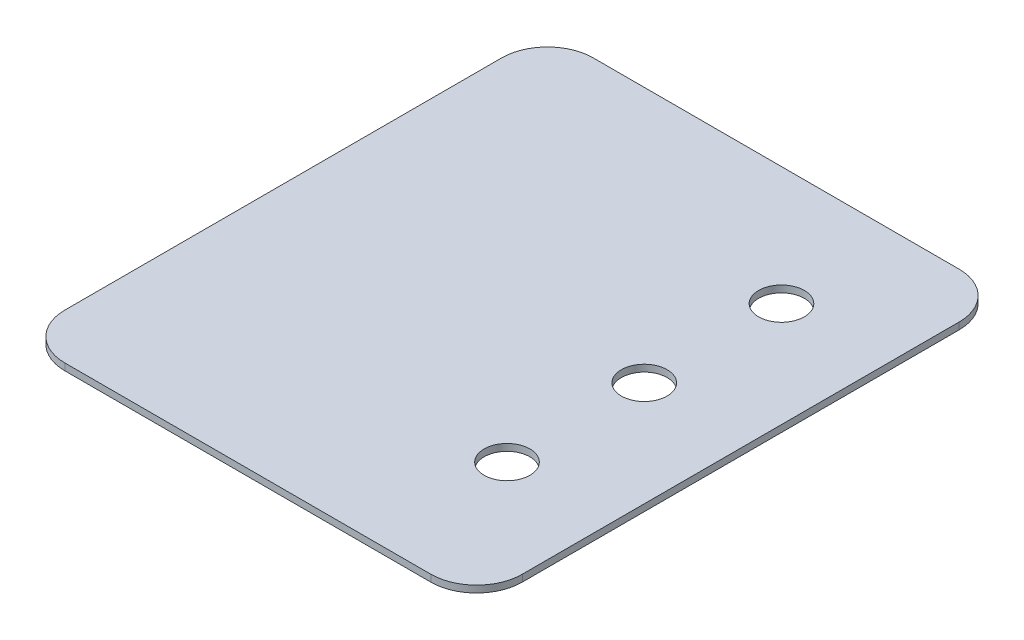
ISO-10303-21;
HEADER;
FILE_DESCRIPTION(('STEP AP214'),'2;1');
FILE_NAME('part.step','',(''),(''),'','','');
FILE_SCHEMA(('AUTOMOTIVE_DESIGN { 1 0 10303 214 1 1 1 1 }'));
ENDSEC;
DATA;
#1=APPLICATION_CONTEXT('core data for automotive mechanical design processes');
#2=APPLICATION_PROTOCOL_DEFINITION('international standard','automotive_design',2000,#1);
#3=PRODUCT_CONTEXT('',#1,'mechanical');
#4=PRODUCT('Part','Part','',(#3));
#5=PRODUCT_RELATED_PRODUCT_CATEGORY('part','',(#4));
#6=PRODUCT_DEFINITION_FORMATION('','',#4);
#7=PRODUCT_DEFINITION_CONTEXT('part definition',#1,'design');
#8=PRODUCT_DEFINITION('design','',#6,#7);
#9=PRODUCT_DEFINITION_SHAPE('','',#8);
#10=(LENGTH_UNIT() NAMED_UNIT(*) SI_UNIT(.MILLI.,.METRE.));
#11=(NAMED_UNIT(*) PLANE_ANGLE_UNIT() SI_UNIT($,.RADIAN.));
#12=(NAMED_UNIT(*) SI_UNIT($,.STERADIAN.) SOLID_ANGLE_UNIT());
#13=UNCERTAINTY_MEASURE_WITH_UNIT(LENGTH_MEASURE(1.E-05),#10,'distance_accuracy_value','');
#14=(GEOMETRIC_REPRESENTATION_CONTEXT(3) GLOBAL_UNCERTAINTY_ASSIGNED_CONTEXT((#13)) GLOBAL_UNIT_ASSIGNED_CONTEXT((#10,
#11,#12)) REPRESENTATION_CONTEXT('',''));
#15=CARTESIAN_POINT('',(0.,0.,0.));
#16=DIRECTION('',(0.,0.,1.));
#17=DIRECTION('',(1.,0.,0.));
#18=AXIS2_PLACEMENT_3D('',#15,#16,#17);
#19=CARTESIAN_POINT('',(-16.,0.6,19.1));
#20=DIRECTION('',(0.,-1.,0.));
#21=DIRECTION('',(0.,0.,-1.));
#22=AXIS2_PLACEMENT_3D('',#19,#20,#21);
#23=CYLINDRICAL_SURFACE('',#22,4.);
#24=CARTESIAN_POINT('',(-16.,0.,19.1));
#25=DIRECTION('',(0.,1.,0.));
#26=DIRECTION('',(0.,0.,1.));
#27=AXIS2_PLACEMENT_3D('',#24,#25,#26);
#28=CIRCLE('',#27,4.);
#29=CARTESIAN_POINT('',(-20.,0.,19.1));
#30=VERTEX_POINT('',#29);
#31=CARTESIAN_POINT('',(-16.,0.,23.1));
#32=VERTEX_POINT('',#31);
#33=EDGE_CURVE('E139',#30,#32,#28,.T.);
#34=ORIENTED_EDGE('',*,*,#33,.T.);
#35=DIRECTION('',(0.,-1.,0.));
#36=VECTOR('',#35,1.);
#37=CARTESIAN_POINT('',(-16.,0.6,23.1));
#38=LINE('',#37,#36);
#39=CARTESIAN_POINT('',(-16.,0.6,23.1));
#40=VERTEX_POINT('',#39);
#41=EDGE_CURVE('E11',#40,#32,#38,.T.);
#42=ORIENTED_EDGE('',*,*,#41,.F.);
#43=CARTESIAN_POINT('',(-16.,0.6,19.1));
#44=DIRECTION('',(0.,1.,0.));
#45=DIRECTION('',(0.,0.,1.));
#46=AXIS2_PLACEMENT_3D('',#43,#44,#45);
#47=CIRCLE('',#46,4.);
#48=CARTESIAN_POINT('',(-20.,0.6,19.1));
#49=VERTEX_POINT('',#48);
#50=EDGE_CURVE('E154',#49,#40,#47,.T.);
#51=ORIENTED_EDGE('',*,*,#50,.F.);
#52=DIRECTION('',(0.,-1.,0.));
#53=VECTOR('',#52,1.);
#54=CARTESIAN_POINT('',(-20.,0.6,19.1));
#55=LINE('',#54,#53);
#56=EDGE_CURVE('E135',#49,#30,#55,.T.);
#57=ORIENTED_EDGE('',*,*,#56,.T.);
#58=EDGE_LOOP('',(#34,#42,#51,#57));
#59=FACE_BOUND('',#58,.T.);
#60=ADVANCED_FACE('F41',(#59),#23,.T.);
#61=CARTESIAN_POINT('',(-16.,0.6,23.1));
#62=DIRECTION('',(0.,0.,-1.));
#63=DIRECTION('',(-1.,0.,0.));
#64=AXIS2_PLACEMENT_3D('',#61,#62,#63);
#65=PLANE('',#64);
#66=DIRECTION('',(1.,0.,0.));
#67=VECTOR('',#66,1.);
#68=CARTESIAN_POINT('',(-16.,0.,23.1));
#69=LINE('',#68,#67);
#70=CARTESIAN_POINT('',(16.,0.,23.1));
#71=VERTEX_POINT('',#70);
#72=EDGE_CURVE('E142',#32,#71,#69,.T.);
#73=ORIENTED_EDGE('',*,*,#72,.T.);
#74=DIRECTION('',(0.,-1.,0.));
#75=VECTOR('',#74,1.);
#76=CARTESIAN_POINT('',(16.,0.6,23.1));
#77=LINE('',#76,#75);
#78=CARTESIAN_POINT('',(16.,0.6,23.1));
#79=VERTEX_POINT('',#78);
#80=EDGE_CURVE('E50',#79,#71,#77,.T.);
#81=ORIENTED_EDGE('',*,*,#80,.F.);
#82=DIRECTION('',(1.,0.,0.));
#83=VECTOR('',#82,1.);
#84=CARTESIAN_POINT('',(-16.,0.6,23.1));
#85=LINE('',#84,#83);
#86=EDGE_CURVE('E102',#40,#79,#85,.T.);
#87=ORIENTED_EDGE('',*,*,#86,.F.);
#88=ORIENTED_EDGE('',*,*,#41,.T.);
#89=EDGE_LOOP('',(#73,#81,#87,#88));
#90=FACE_BOUND('',#89,.T.);
#91=ADVANCED_FACE('F248',(#90),#65,.F.);
#92=CARTESIAN_POINT('',(16.,0.6,19.1));
#93=DIRECTION('',(0.,-1.,0.));
#94=DIRECTION('',(0.,0.,-1.));
#95=AXIS2_PLACEMENT_3D('',#92,#93,#94);
#96=CYLINDRICAL_SURFACE('',#95,4.);
#97=CARTESIAN_POINT('',(16.,0.,19.1));
#98=DIRECTION('',(0.,1.,0.));
#99=DIRECTION('',(0.,0.,1.));
#100=AXIS2_PLACEMENT_3D('',#97,#98,#99);
#101=CIRCLE('',#100,4.);
#102=CARTESIAN_POINT('',(20.,0.,19.1));
#103=VERTEX_POINT('',#102);
#104=EDGE_CURVE('E145',#71,#103,#101,.T.);
#105=ORIENTED_EDGE('',*,*,#104,.T.);
#106=DIRECTION('',(0.,-1.,0.));
#107=VECTOR('',#106,1.);
#108=CARTESIAN_POINT('',(20.,0.6,19.1));
#109=LINE('',#108,#107);
#110=CARTESIAN_POINT('',(20.,0.6,19.1));
#111=VERTEX_POINT('',#110);
#112=EDGE_CURVE('E161',#111,#103,#109,.T.);
#113=ORIENTED_EDGE('',*,*,#112,.F.);
#114=CARTESIAN_POINT('',(16.,0.6,19.1));
#115=DIRECTION('',(0.,1.,0.));
#116=DIRECTION('',(0.,0.,1.));
#117=AXIS2_PLACEMENT_3D('',#114,#115,#116);
#118=CIRCLE('',#117,4.);
#119=EDGE_CURVE('E215',#79,#111,#118,.T.);
#120=ORIENTED_EDGE('',*,*,#119,.F.);
#121=ORIENTED_EDGE('',*,*,#80,.T.);
#122=EDGE_LOOP('',(#105,#113,#120,#121));
#123=FACE_BOUND('',#122,.T.);
#124=ADVANCED_FACE('F252',(#123),#96,.T.);
#125=CARTESIAN_POINT('',(20.,0.6,-19.1));
#126=DIRECTION('',(-1.,0.,0.));
#127=DIRECTION('',(0.,0.,1.));
#128=AXIS2_PLACEMENT_3D('',#125,#126,#127);
#129=PLANE('',#128);
#130=DIRECTION('',(0.,0.,-1.));
#131=VECTOR('',#130,1.);
#132=CARTESIAN_POINT('',(20.,0.,-19.1));
#133=LINE('',#132,#131);
#134=CARTESIAN_POINT('',(20.,0.,-19.1));
#135=VERTEX_POINT('',#134);
#136=EDGE_CURVE('E147',#103,#135,#133,.T.);
#137=ORIENTED_EDGE('',*,*,#136,.T.);
#138=DIRECTION('',(0.,-1.,0.));
#139=VECTOR('',#138,1.);
#140=CARTESIAN_POINT('',(20.,0.6,-19.1));
#141=LINE('',#140,#139);
#142=CARTESIAN_POINT('',(20.,0.6,-19.1));
#143=VERTEX_POINT('',#142);
#144=EDGE_CURVE('E158',#143,#135,#141,.T.);
#145=ORIENTED_EDGE('',*,*,#144,.F.);
#146=DIRECTION('',(0.,0.,-1.));
#147=VECTOR('',#146,1.);
#148=CARTESIAN_POINT('',(20.,0.6,-19.1));
#149=LINE('',#148,#147);
#150=EDGE_CURVE('E217',#111,#143,#149,.T.);
#151=ORIENTED_EDGE('',*,*,#150,.F.);
#152=ORIENTED_EDGE('',*,*,#112,.T.);
#153=EDGE_LOOP('',(#137,#145,#151,#152));
#154=FACE_BOUND('',#153,.T.);
#155=ADVANCED_FACE('F223',(#154),#129,.F.);
#156=CARTESIAN_POINT('',(16.,0.6,-19.1));
#157=DIRECTION('',(0.,-1.,0.));
#158=DIRECTION('',(0.,0.,-1.));
#159=AXIS2_PLACEMENT_3D('',#156,#157,#158);
#160=CYLINDRICAL_SURFACE('',#159,4.);
#161=CARTESIAN_POINT('',(16.,0.,-19.1));
#162=DIRECTION('',(0.,1.,0.));
#163=DIRECTION('',(0.,0.,-1.));
#164=AXIS2_PLACEMENT_3D('',#161,#162,#163);
#165=CIRCLE('',#164,4.);
#166=CARTESIAN_POINT('',(16.,0.,-23.1));
#167=VERTEX_POINT('',#166);
#168=EDGE_CURVE('E149',#135,#167,#165,.T.);
#169=ORIENTED_EDGE('',*,*,#168,.T.);
#170=DIRECTION('',(0.,-1.,0.));
#171=VECTOR('',#170,1.);
#172=CARTESIAN_POINT('',(16.,0.6,-23.1));
#173=LINE('',#172,#171);
#174=CARTESIAN_POINT('',(16.,0.6,-23.1));
#175=VERTEX_POINT('',#174);
#176=EDGE_CURVE('E130',#175,#167,#173,.T.);
#177=ORIENTED_EDGE('',*,*,#176,.F.);
#178=CARTESIAN_POINT('',(16.,0.6,-19.1));
#179=DIRECTION('',(0.,1.,0.));
#180=DIRECTION('',(0.,0.,-1.));
#181=AXIS2_PLACEMENT_3D('',#178,#179,#180);
#182=CIRCLE('',#181,4.);
#183=EDGE_CURVE('E121',#143,#175,#182,.T.);
#184=ORIENTED_EDGE('',*,*,#183,.F.);
#185=ORIENTED_EDGE('',*,*,#144,.T.);
#186=EDGE_LOOP('',(#169,#177,#184,#185));
#187=FACE_BOUND('',#186,.T.);
#188=ADVANCED_FACE('F227',(#187),#160,.T.);
#189=CARTESIAN_POINT('',(-16.,0.6,-23.1));
#190=DIRECTION('',(0.,0.,1.));
#191=DIRECTION('',(1.,0.,0.));
#192=AXIS2_PLACEMENT_3D('',#189,#190,#191);
#193=PLANE('',#192);
#194=DIRECTION('',(-1.,0.,0.));
#195=VECTOR('',#194,1.);
#196=CARTESIAN_POINT('',(-16.,0.,-23.1));
#197=LINE('',#196,#195);
#198=CARTESIAN_POINT('',(-16.,0.,-23.1));
#199=VERTEX_POINT('',#198);
#200=EDGE_CURVE('E129',#167,#199,#197,.T.);
#201=ORIENTED_EDGE('',*,*,#200,.T.);
#202=DIRECTION('',(0.,-1.,0.));
#203=VECTOR('',#202,1.);
#204=CARTESIAN_POINT('',(-16.,0.6,-23.1));
#205=LINE('',#204,#203);
#206=CARTESIAN_POINT('',(-16.,0.6,-23.1));
#207=VERTEX_POINT('',#206);
#208=EDGE_CURVE('E126',#207,#199,#205,.T.);
#209=ORIENTED_EDGE('',*,*,#208,.F.);
#210=DIRECTION('',(-1.,0.,0.));
#211=VECTOR('',#210,1.);
#212=CARTESIAN_POINT('',(-16.,0.6,-23.1));
#213=LINE('',#212,#211);
#214=EDGE_CURVE('E115',#175,#207,#213,.T.);
#215=ORIENTED_EDGE('',*,*,#214,.F.);
#216=ORIENTED_EDGE('',*,*,#176,.T.);
#217=EDGE_LOOP('',(#201,#209,#215,#216));
#218=FACE_BOUND('',#217,.T.);
#219=ADVANCED_FACE('F127',(#218),#193,.F.);
#220=CARTESIAN_POINT('',(-16.,0.6,-19.1));
#221=DIRECTION('',(0.,-1.,0.));
#222=DIRECTION('',(0.,0.,-1.));
#223=AXIS2_PLACEMENT_3D('',#220,#221,#222);
#224=CYLINDRICAL_SURFACE('',#223,4.);
#225=CARTESIAN_POINT('',(-16.,0.,-19.1));
#226=DIRECTION('',(0.,1.,0.));
#227=DIRECTION('',(0.,0.,1.));
#228=AXIS2_PLACEMENT_3D('',#225,#226,#227);
#229=CIRCLE('',#228,4.);
#230=CARTESIAN_POINT('',(-20.,0.,-19.1));
#231=VERTEX_POINT('',#230);
#232=EDGE_CURVE('E88',#199,#231,#229,.T.);
#233=ORIENTED_EDGE('',*,*,#232,.T.);
#234=DIRECTION('',(0.,-1.,0.));
#235=VECTOR('',#234,1.);
#236=CARTESIAN_POINT('',(-20.,0.6,-19.1));
#237=LINE('',#236,#235);
#238=CARTESIAN_POINT('',(-20.,0.6,-19.1));
#239=VERTEX_POINT('',#238);
#240=EDGE_CURVE('E131',#239,#231,#237,.T.);
#241=ORIENTED_EDGE('',*,*,#240,.F.);
#242=CARTESIAN_POINT('',(-16.,0.6,-19.1));
#243=DIRECTION('',(0.,1.,0.));
#244=DIRECTION('',(0.,0.,1.));
#245=AXIS2_PLACEMENT_3D('',#242,#243,#244);
#246=CIRCLE('',#245,4.);
#247=EDGE_CURVE('E119',#207,#239,#246,.T.);
#248=ORIENTED_EDGE('',*,*,#247,.F.);
#249=ORIENTED_EDGE('',*,*,#208,.T.);
#250=EDGE_LOOP('',(#233,#241,#248,#249));
#251=FACE_BOUND('',#250,.T.);
#252=ADVANCED_FACE('F133',(#251),#224,.T.);
#253=CARTESIAN_POINT('',(-20.,0.6,-19.1));
#254=DIRECTION('',(1.,0.,0.));
#255=DIRECTION('',(0.,0.,-1.));
#256=AXIS2_PLACEMENT_3D('',#253,#254,#255);
#257=PLANE('',#256);
#258=DIRECTION('',(0.,0.,1.));
#259=VECTOR('',#258,1.);
#260=CARTESIAN_POINT('',(-20.,0.,-19.1));
#261=LINE('',#260,#259);
#262=EDGE_CURVE('E94',#231,#30,#261,.T.);
#263=ORIENTED_EDGE('',*,*,#262,.T.);
#264=ORIENTED_EDGE('',*,*,#56,.F.);
#265=DIRECTION('',(0.,0.,1.));
#266=VECTOR('',#265,1.);
#267=CARTESIAN_POINT('',(-20.,0.6,-19.1));
#268=LINE('',#267,#266);
#269=EDGE_CURVE('E59',#239,#49,#268,.T.);
#270=ORIENTED_EDGE('',*,*,#269,.F.);
#271=ORIENTED_EDGE('',*,*,#240,.T.);
#272=EDGE_LOOP('',(#263,#264,#270,#271));
#273=FACE_BOUND('',#272,.T.);
#274=ADVANCED_FACE('F235',(#273),#257,.F.);
#275=CARTESIAN_POINT('',(-16.,0.6,19.1));
#276=DIRECTION('',(0.,1.,0.));
#277=DIRECTION('',(0.,0.,1.));
#278=AXIS2_PLACEMENT_3D('',#275,#276,#277);
#279=PLANE('',#278);
#280=CARTESIAN_POINT('',(10.8424460198941,0.6,11.2783959341694));
#281=DIRECTION('',(0.,1.,0.));
#282=DIRECTION('',(0.,0.,1.));
#283=AXIS2_PLACEMENT_3D('',#280,#281,#282);
#284=CIRCLE('',#283,2.);
#285=CARTESIAN_POINT('',(10.8424460198941,0.6,13.2783959341694));
#286=VERTEX_POINT('',#285);
#287=EDGE_CURVE('E170',#286,#286,#284,.T.);
#288=ORIENTED_EDGE('',*,*,#287,.F.);
#289=EDGE_LOOP('',(#288));
#290=FACE_BOUND('',#289,.T.);
#291=CARTESIAN_POINT('',(10.842446019894,0.6,-0.721604065830581));
#292=DIRECTION('',(0.,1.,0.));
#293=DIRECTION('',(0.,0.,1.));
#294=AXIS2_PLACEMENT_3D('',#291,#292,#293);
#295=CIRCLE('',#294,2.);
#296=CARTESIAN_POINT('',(10.842446019894,0.6,1.27839593416942));
#297=VERTEX_POINT('',#296);
#298=EDGE_CURVE('E205',#297,#297,#295,.T.);
#299=ORIENTED_EDGE('',*,*,#298,.F.);
#300=EDGE_LOOP('',(#299));
#301=FACE_BOUND('',#300,.T.);
#302=CARTESIAN_POINT('',(10.842446019894,0.6,-12.7216040658306));
#303=DIRECTION('',(0.,1.,0.));
#304=DIRECTION('',(0.,0.,1.));
#305=AXIS2_PLACEMENT_3D('',#302,#303,#304);
#306=CIRCLE('',#305,2.);
#307=CARTESIAN_POINT('',(10.842446019894,0.6,-10.7216040658306));
#308=VERTEX_POINT('',#307);
#309=EDGE_CURVE('E201',#308,#308,#306,.T.);
#310=ORIENTED_EDGE('',*,*,#309,.F.);
#311=EDGE_LOOP('',(#310));
#312=FACE_BOUND('',#311,.T.);
#313=ORIENTED_EDGE('',*,*,#50,.T.);
#314=ORIENTED_EDGE('',*,*,#86,.T.);
#315=ORIENTED_EDGE('',*,*,#119,.T.);
#316=ORIENTED_EDGE('',*,*,#150,.T.);
#317=ORIENTED_EDGE('',*,*,#183,.T.);
#318=ORIENTED_EDGE('',*,*,#214,.T.);
#319=ORIENTED_EDGE('',*,*,#247,.T.);
#320=ORIENTED_EDGE('',*,*,#269,.T.);
#321=EDGE_LOOP('',(#313,#314,#315,#316,#317,#318,#319,#320));
#322=FACE_BOUND('',#321,.T.);
#323=ADVANCED_FACE('F117',(#290,#301,#312,#322),#279,.T.);
#324=CARTESIAN_POINT('',(-16.,0.,19.1));
#325=DIRECTION('',(0.,1.,0.));
#326=DIRECTION('',(0.,0.,1.));
#327=AXIS2_PLACEMENT_3D('',#324,#325,#326);
#328=PLANE('',#327);
#329=CARTESIAN_POINT('',(0.,0.,-17.));
#330=DIRECTION('',(0.,1.,0.));
#331=DIRECTION('',(0.,0.,1.));
#332=AXIS2_PLACEMENT_3D('',#329,#330,#331);
#333=CIRCLE('',#332,1.15);
#334=CARTESIAN_POINT('',(0.,0.,-15.85));
#335=VERTEX_POINT('',#334);
#336=EDGE_CURVE('E44',#335,#335,#333,.T.);
#337=ORIENTED_EDGE('',*,*,#336,.T.);
#338=EDGE_LOOP('',(#337));
#339=FACE_BOUND('',#338,.T.);
#340=CARTESIAN_POINT('',(-15.8,0.,-16.9999999999999));
#341=DIRECTION('',(0.,1.,0.));
#342=DIRECTION('',(0.,0.,1.));
#343=AXIS2_PLACEMENT_3D('',#340,#341,#342);
#344=CIRCLE('',#343,1.15);
#345=CARTESIAN_POINT('',(-15.8,0.,-15.8499999999999));
#346=VERTEX_POINT('',#345);
#347=EDGE_CURVE('E196',#346,#346,#344,.T.);
#348=ORIENTED_EDGE('',*,*,#347,.T.);
#349=EDGE_LOOP('',(#348));
#350=FACE_BOUND('',#349,.T.);
#351=CARTESIAN_POINT('',(0.,0.,0.));
#352=DIRECTION('',(0.,1.,0.));
#353=DIRECTION('',(0.,0.,1.));
#354=AXIS2_PLACEMENT_3D('',#351,#352,#353);
#355=CIRCLE('',#354,1.15);
#356=CARTESIAN_POINT('',(0.,0.,1.15));
#357=VERTEX_POINT('',#356);
#358=EDGE_CURVE('E194',#357,#357,#355,.T.);
#359=ORIENTED_EDGE('',*,*,#358,.T.);
#360=EDGE_LOOP('',(#359));
#361=FACE_BOUND('',#360,.T.);
#362=CARTESIAN_POINT('',(-15.8,0.,1.11022302462516E-13));
#363=DIRECTION('',(0.,1.,0.));
#364=DIRECTION('',(0.,0.,1.));
#365=AXIS2_PLACEMENT_3D('',#362,#363,#364);
#366=CIRCLE('',#365,1.15);
#367=CARTESIAN_POINT('',(-15.8,0.,1.15000000000011));
#368=VERTEX_POINT('',#367);
#369=EDGE_CURVE('E191',#368,#368,#366,.T.);
#370=ORIENTED_EDGE('',*,*,#369,.T.);
#371=EDGE_LOOP('',(#370));
#372=FACE_BOUND('',#371,.T.);
#373=CARTESIAN_POINT('',(0.,0.,17.));
#374=DIRECTION('',(0.,1.,0.));
#375=DIRECTION('',(0.,0.,1.));
#376=AXIS2_PLACEMENT_3D('',#373,#374,#375);
#377=CIRCLE('',#376,1.15);
#378=CARTESIAN_POINT('',(0.,0.,18.15));
#379=VERTEX_POINT('',#378);
#380=EDGE_CURVE('E188',#379,#379,#377,.T.);
#381=ORIENTED_EDGE('',*,*,#380,.T.);
#382=EDGE_LOOP('',(#381));
#383=FACE_BOUND('',#382,.T.);
#384=CARTESIAN_POINT('',(-15.8,0.,17.0000000000001));
#385=DIRECTION('',(0.,1.,0.));
#386=DIRECTION('',(0.,0.,1.));
#387=AXIS2_PLACEMENT_3D('',#384,#385,#386);
#388=CIRCLE('',#387,1.15);
#389=CARTESIAN_POINT('',(-15.8,0.,18.1500000000001));
#390=VERTEX_POINT('',#389);
#391=EDGE_CURVE('E185',#390,#390,#388,.T.);
#392=ORIENTED_EDGE('',*,*,#391,.T.);
#393=EDGE_LOOP('',(#392));
#394=FACE_BOUND('',#393,.T.);
#395=CARTESIAN_POINT('',(15.8,0.,-1.11022302462516E-13));
#396=DIRECTION('',(0.,1.,0.));
#397=DIRECTION('',(0.,0.,1.));
#398=AXIS2_PLACEMENT_3D('',#395,#396,#397);
#399=CIRCLE('',#398,1.15);
#400=CARTESIAN_POINT('',(15.8,0.,1.14999999999989));
#401=VERTEX_POINT('',#400);
#402=EDGE_CURVE('E182',#401,#401,#399,.T.);
#403=ORIENTED_EDGE('',*,*,#402,.T.);
#404=EDGE_LOOP('',(#403));
#405=FACE_BOUND('',#404,.T.);
#406=CARTESIAN_POINT('',(15.8,0.,16.9999999999999));
#407=DIRECTION('',(0.,1.,0.));
#408=DIRECTION('',(0.,0.,1.));
#409=AXIS2_PLACEMENT_3D('',#406,#407,#408);
#410=CIRCLE('',#409,1.15);
#411=CARTESIAN_POINT('',(15.8,0.,18.1499999999999));
#412=VERTEX_POINT('',#411);
#413=EDGE_CURVE('E178',#412,#412,#410,.T.);
#414=ORIENTED_EDGE('',*,*,#413,.T.);
#415=EDGE_LOOP('',(#414));
#416=FACE_BOUND('',#415,.T.);
#417=CARTESIAN_POINT('',(15.8,0.,-17.0000000000001));
#418=DIRECTION('',(0.,1.,0.));
#419=DIRECTION('',(0.,0.,1.));
#420=AXIS2_PLACEMENT_3D('',#417,#418,#419);
#421=CIRCLE('',#420,1.15);
#422=CARTESIAN_POINT('',(15.8,0.,-15.8500000000001));
#423=VERTEX_POINT('',#422);
#424=EDGE_CURVE('E175',#423,#423,#421,.T.);
#425=ORIENTED_EDGE('',*,*,#424,.T.);
#426=EDGE_LOOP('',(#425));
#427=FACE_BOUND('',#426,.T.);
#428=CARTESIAN_POINT('',(10.8424460198941,0.,11.2783959341694));
#429=DIRECTION('',(0.,1.,0.));
#430=DIRECTION('',(0.,0.,1.));
#431=AXIS2_PLACEMENT_3D('',#428,#429,#430);
#432=CIRCLE('',#431,2.);
#433=CARTESIAN_POINT('',(10.8424460198941,0.,13.2783959341694));
#434=VERTEX_POINT('',#433);
#435=EDGE_CURVE('E143',#434,#434,#432,.T.);
#436=ORIENTED_EDGE('',*,*,#435,.T.);
#437=EDGE_LOOP('',(#436));
#438=FACE_BOUND('',#437,.T.);
#439=CARTESIAN_POINT('',(10.842446019894,0.,-0.721604065830581));
#440=DIRECTION('',(0.,1.,0.));
#441=DIRECTION('',(0.,0.,1.));
#442=AXIS2_PLACEMENT_3D('',#439,#440,#441);
#443=CIRCLE('',#442,2.);
#444=CARTESIAN_POINT('',(10.842446019894,0.,1.27839593416942));
#445=VERTEX_POINT('',#444);
#446=EDGE_CURVE('E169',#445,#445,#443,.T.);
#447=ORIENTED_EDGE('',*,*,#446,.T.);
#448=EDGE_LOOP('',(#447));
#449=FACE_BOUND('',#448,.T.);
#450=CARTESIAN_POINT('',(10.842446019894,0.,-12.7216040658306));
#451=DIRECTION('',(0.,1.,0.));
#452=DIRECTION('',(0.,0.,1.));
#453=AXIS2_PLACEMENT_3D('',#450,#451,#452);
#454=CIRCLE('',#453,2.);
#455=CARTESIAN_POINT('',(10.842446019894,0.,-10.7216040658306));
#456=VERTEX_POINT('',#455);
#457=EDGE_CURVE('E166',#456,#456,#454,.T.);
#458=ORIENTED_EDGE('',*,*,#457,.T.);
#459=EDGE_LOOP('',(#458));
#460=FACE_BOUND('',#459,.T.);
#461=ORIENTED_EDGE('',*,*,#33,.F.);
#462=ORIENTED_EDGE('',*,*,#262,.F.);
#463=ORIENTED_EDGE('',*,*,#232,.F.);
#464=ORIENTED_EDGE('',*,*,#200,.F.);
#465=ORIENTED_EDGE('',*,*,#168,.F.);
#466=ORIENTED_EDGE('',*,*,#136,.F.);
#467=ORIENTED_EDGE('',*,*,#104,.F.);
#468=ORIENTED_EDGE('',*,*,#72,.F.);
#469=EDGE_LOOP('',(#461,#462,#463,#464,#465,#466,#467,#468));
#470=FACE_BOUND('',#469,.T.);
#471=ADVANCED_FACE('F230',(#339,#350,#361,#372,#383,#394,#405,#416,#427,#438,#449,#460,#470),
#328,.F.);
#472=CARTESIAN_POINT('',(10.842446019894,-9.4,-12.7216040658306));
#473=DIRECTION('',(0.,1.,0.));
#474=DIRECTION('',(0.,0.,1.));
#475=AXIS2_PLACEMENT_3D('',#472,#473,#474);
#476=CYLINDRICAL_SURFACE('',#475,2.);
#477=ORIENTED_EDGE('',*,*,#309,.T.);
#478=EDGE_LOOP('',(#477));
#479=FACE_BOUND('',#478,.T.);
#480=ORIENTED_EDGE('',*,*,#457,.F.);
#481=EDGE_LOOP('',(#480));
#482=FACE_BOUND('',#481,.T.);
#483=ADVANCED_FACE('F294',(#479,#482),#476,.F.);
#484=CARTESIAN_POINT('',(10.842446019894,-9.4,-0.721604065830581));
#485=DIRECTION('',(0.,1.,0.));
#486=DIRECTION('',(0.,0.,1.));
#487=AXIS2_PLACEMENT_3D('',#484,#485,#486);
#488=CYLINDRICAL_SURFACE('',#487,2.);
#489=ORIENTED_EDGE('',*,*,#298,.T.);
#490=EDGE_LOOP('',(#489));
#491=FACE_BOUND('',#490,.T.);
#492=ORIENTED_EDGE('',*,*,#446,.F.);
#493=EDGE_LOOP('',(#492));
#494=FACE_BOUND('',#493,.T.);
#495=ADVANCED_FACE('F302',(#491,#494),#488,.F.);
#496=CARTESIAN_POINT('',(10.8424460198941,-9.4,11.2783959341694));
#497=DIRECTION('',(0.,1.,0.));
#498=DIRECTION('',(0.,0.,1.));
#499=AXIS2_PLACEMENT_3D('',#496,#497,#498);
#500=CYLINDRICAL_SURFACE('',#499,2.);
#501=ORIENTED_EDGE('',*,*,#287,.T.);
#502=EDGE_LOOP('',(#501));
#503=FACE_BOUND('',#502,.T.);
#504=ORIENTED_EDGE('',*,*,#435,.F.);
#505=EDGE_LOOP('',(#504));
#506=FACE_BOUND('',#505,.T.);
#507=ADVANCED_FACE('F311',(#503,#506),#500,.F.);
#508=CARTESIAN_POINT('',(15.8,-2.4,-17.0000000000001));
#509=DIRECTION('',(0.,1.,0.));
#510=DIRECTION('',(0.,0.,1.));
#511=AXIS2_PLACEMENT_3D('',#508,#509,#510);
#512=CYLINDRICAL_SURFACE('',#511,1.15);
#513=CARTESIAN_POINT('',(15.8,-2.4,-17.0000000000001));
#514=DIRECTION('',(0.,1.,0.));
#515=DIRECTION('',(0.,0.,1.));
#516=AXIS2_PLACEMENT_3D('',#513,#514,#515);
#517=CIRCLE('',#516,1.15);
#518=CARTESIAN_POINT('',(15.8,-2.4,-15.8500000000001));
#519=VERTEX_POINT('',#518);
#520=EDGE_CURVE('E179',#519,#519,#517,.T.);
#521=ORIENTED_EDGE('',*,*,#520,.T.);
#522=EDGE_LOOP('',(#521));
#523=FACE_BOUND('',#522,.T.);
#524=ORIENTED_EDGE('',*,*,#424,.F.);
#525=EDGE_LOOP('',(#524));
#526=FACE_BOUND('',#525,.T.);
#527=ADVANCED_FACE('F320',(#523,#526),#512,.T.);
#528=CARTESIAN_POINT('',(15.8,-2.4,-17.0000000000001));
#529=DIRECTION('',(0.,1.,0.));
#530=DIRECTION('',(0.,0.,1.));
#531=AXIS2_PLACEMENT_3D('',#528,#529,#530);
#532=PLANE('',#531);
#533=ORIENTED_EDGE('',*,*,#520,.F.);
#534=EDGE_LOOP('',(#533));
#535=FACE_BOUND('',#534,.T.);
#536=ADVANCED_FACE('F329',(#535),#532,.F.);
#537=CARTESIAN_POINT('',(15.8,-2.4,16.9999999999999));
#538=DIRECTION('',(0.,1.,0.));
#539=DIRECTION('',(0.,0.,1.));
#540=AXIS2_PLACEMENT_3D('',#537,#538,#539);
#541=CYLINDRICAL_SURFACE('',#540,1.15);
#542=CARTESIAN_POINT('',(15.8,-2.4,16.9999999999999));
#543=DIRECTION('',(0.,1.,0.));
#544=DIRECTION('',(0.,0.,1.));
#545=AXIS2_PLACEMENT_3D('',#542,#543,#544);
#546=CIRCLE('',#545,1.15);
#547=CARTESIAN_POINT('',(15.8,-2.4,18.1499999999999));
#548=VERTEX_POINT('',#547);
#549=EDGE_CURVE('E513',#548,#548,#546,.T.);
#550=ORIENTED_EDGE('',*,*,#549,.T.);
#551=EDGE_LOOP('',(#550));
#552=FACE_BOUND('',#551,.T.);
#553=ORIENTED_EDGE('',*,*,#413,.F.);
#554=EDGE_LOOP('',(#553));
#555=FACE_BOUND('',#554,.T.);
#556=ADVANCED_FACE('F339',(#552,#555),#541,.T.);
#557=CARTESIAN_POINT('',(15.8,-2.4,16.9999999999999));
#558=DIRECTION('',(0.,1.,0.));
#559=DIRECTION('',(0.,0.,1.));
#560=AXIS2_PLACEMENT_3D('',#557,#558,#559);
#561=PLANE('',#560);
#562=ORIENTED_EDGE('',*,*,#549,.F.);
#563=EDGE_LOOP('',(#562));
#564=FACE_BOUND('',#563,.T.);
#565=ADVANCED_FACE('F349',(#564),#561,.F.);
#566=CARTESIAN_POINT('',(15.8,-2.4,-1.11022302462516E-13));
#567=DIRECTION('',(0.,1.,0.));
#568=DIRECTION('',(0.,0.,1.));
#569=AXIS2_PLACEMENT_3D('',#566,#567,#568);
#570=CYLINDRICAL_SURFACE('',#569,1.15);
#571=CARTESIAN_POINT('',(15.8,-2.4,-1.11022302462516E-13));
#572=DIRECTION('',(0.,1.,0.));
#573=DIRECTION('',(0.,0.,1.));
#574=AXIS2_PLACEMENT_3D('',#571,#572,#573);
#575=CIRCLE('',#574,1.15);
#576=CARTESIAN_POINT('',(15.8,-2.4,1.14999999999989));
#577=VERTEX_POINT('',#576);
#578=EDGE_CURVE('E541',#577,#577,#575,.T.);
#579=ORIENTED_EDGE('',*,*,#578,.T.);
#580=EDGE_LOOP('',(#579));
#581=FACE_BOUND('',#580,.T.);
#582=ORIENTED_EDGE('',*,*,#402,.F.);
#583=EDGE_LOOP('',(#582));
#584=FACE_BOUND('',#583,.T.);
#585=ADVANCED_FACE('F359',(#581,#584),#570,.T.);
#586=CARTESIAN_POINT('',(15.8,-2.4,-1.11022302462516E-13));
#587=DIRECTION('',(0.,1.,0.));
#588=DIRECTION('',(0.,0.,1.));
#589=AXIS2_PLACEMENT_3D('',#586,#587,#588);
#590=PLANE('',#589);
#591=ORIENTED_EDGE('',*,*,#578,.F.);
#592=EDGE_LOOP('',(#591));
#593=FACE_BOUND('',#592,.T.);
#594=ADVANCED_FACE('F369',(#593),#590,.F.);
#595=CARTESIAN_POINT('',(-15.8,-2.4,17.0000000000001));
#596=DIRECTION('',(0.,1.,0.));
#597=DIRECTION('',(0.,0.,1.));
#598=AXIS2_PLACEMENT_3D('',#595,#596,#597);
#599=CYLINDRICAL_SURFACE('',#598,1.15);
#600=CARTESIAN_POINT('',(-15.8,-2.4,17.0000000000001));
#601=DIRECTION('',(0.,1.,0.));
#602=DIRECTION('',(0.,0.,1.));
#603=AXIS2_PLACEMENT_3D('',#600,#601,#602);
#604=CIRCLE('',#603,1.15);
#605=CARTESIAN_POINT('',(-15.8,-2.4,18.1500000000001));
#606=VERTEX_POINT('',#605);
#607=EDGE_CURVE('E537',#606,#606,#604,.T.);
#608=ORIENTED_EDGE('',*,*,#607,.T.);
#609=EDGE_LOOP('',(#608));
#610=FACE_BOUND('',#609,.T.);
#611=ORIENTED_EDGE('',*,*,#391,.F.);
#612=EDGE_LOOP('',(#611));
#613=FACE_BOUND('',#612,.T.);
#614=ADVANCED_FACE('F379',(#610,#613),#599,.T.);
#615=CARTESIAN_POINT('',(-15.8,-2.4,17.0000000000001));
#616=DIRECTION('',(0.,1.,0.));
#617=DIRECTION('',(0.,0.,1.));
#618=AXIS2_PLACEMENT_3D('',#615,#616,#617);
#619=PLANE('',#618);
#620=ORIENTED_EDGE('',*,*,#607,.F.);
#621=EDGE_LOOP('',(#620));
#622=FACE_BOUND('',#621,.T.);
#623=ADVANCED_FACE('F389',(#622),#619,.F.);
#624=CARTESIAN_POINT('',(0.,-2.4,17.));
#625=DIRECTION('',(0.,1.,0.));
#626=DIRECTION('',(0.,0.,1.));
#627=AXIS2_PLACEMENT_3D('',#624,#625,#626);
#628=CYLINDRICAL_SURFACE('',#627,1.15);
#629=CARTESIAN_POINT('',(0.,-2.4,17.));
#630=DIRECTION('',(0.,1.,0.));
#631=DIRECTION('',(0.,0.,1.));
#632=AXIS2_PLACEMENT_3D('',#629,#630,#631);
#633=CIRCLE('',#632,1.15);
#634=CARTESIAN_POINT('',(0.,-2.4,18.15));
#635=VERTEX_POINT('',#634);
#636=EDGE_CURVE('E520',#635,#635,#633,.T.);
#637=ORIENTED_EDGE('',*,*,#636,.T.);
#638=EDGE_LOOP('',(#637));
#639=FACE_BOUND('',#638,.T.);
#640=ORIENTED_EDGE('',*,*,#380,.F.);
#641=EDGE_LOOP('',(#640));
#642=FACE_BOUND('',#641,.T.);
#643=ADVANCED_FACE('F399',(#639,#642),#628,.T.);
#644=CARTESIAN_POINT('',(0.,-2.4,17.));
#645=DIRECTION('',(0.,1.,0.));
#646=DIRECTION('',(0.,0.,1.));
#647=AXIS2_PLACEMENT_3D('',#644,#645,#646);
#648=PLANE('',#647);
#649=ORIENTED_EDGE('',*,*,#636,.F.);
#650=EDGE_LOOP('',(#649));
#651=FACE_BOUND('',#650,.T.);
#652=ADVANCED_FACE('F409',(#651),#648,.F.);
#653=CARTESIAN_POINT('',(-15.8,-2.4,1.11022302462516E-13));
#654=DIRECTION('',(0.,1.,0.));
#655=DIRECTION('',(0.,0.,1.));
#656=AXIS2_PLACEMENT_3D('',#653,#654,#655);
#657=CYLINDRICAL_SURFACE('',#656,1.15);
#658=CARTESIAN_POINT('',(-15.8,-2.4,1.11022302462516E-13));
#659=DIRECTION('',(0.,1.,0.));
#660=DIRECTION('',(0.,0.,1.));
#661=AXIS2_PLACEMENT_3D('',#658,#659,#660);
#662=CIRCLE('',#661,1.15);
#663=CARTESIAN_POINT('',(-15.8,-2.4,1.15000000000011));
#664=VERTEX_POINT('',#663);
#665=EDGE_CURVE('E518',#664,#664,#662,.T.);
#666=ORIENTED_EDGE('',*,*,#665,.T.);
#667=EDGE_LOOP('',(#666));
#668=FACE_BOUND('',#667,.T.);
#669=ORIENTED_EDGE('',*,*,#369,.F.);
#670=EDGE_LOOP('',(#669));
#671=FACE_BOUND('',#670,.T.);
#672=ADVANCED_FACE('F419',(#668,#671),#657,.T.);
#673=CARTESIAN_POINT('',(-15.8,-2.4,1.11022302462516E-13));
#674=DIRECTION('',(0.,1.,0.));
#675=DIRECTION('',(0.,0.,1.));
#676=AXIS2_PLACEMENT_3D('',#673,#674,#675);
#677=PLANE('',#676);
#678=ORIENTED_EDGE('',*,*,#665,.F.);
#679=EDGE_LOOP('',(#678));
#680=FACE_BOUND('',#679,.T.);
#681=ADVANCED_FACE('F429',(#680),#677,.F.);
#682=CARTESIAN_POINT('',(0.,-2.4,0.));
#683=DIRECTION('',(0.,1.,0.));
#684=DIRECTION('',(0.,0.,1.));
#685=AXIS2_PLACEMENT_3D('',#682,#683,#684);
#686=CYLINDRICAL_SURFACE('',#685,1.15);
#687=CARTESIAN_POINT('',(0.,-2.4,0.));
#688=DIRECTION('',(0.,1.,0.));
#689=DIRECTION('',(0.,0.,1.));
#690=AXIS2_PLACEMENT_3D('',#687,#688,#689);
#691=CIRCLE('',#690,1.15);
#692=CARTESIAN_POINT('',(0.,-2.4,1.15));
#693=VERTEX_POINT('',#692);
#694=EDGE_CURVE('E510',#693,#693,#691,.T.);
#695=ORIENTED_EDGE('',*,*,#694,.T.);
#696=EDGE_LOOP('',(#695));
#697=FACE_BOUND('',#696,.T.);
#698=ORIENTED_EDGE('',*,*,#358,.F.);
#699=EDGE_LOOP('',(#698));
#700=FACE_BOUND('',#699,.T.);
#701=ADVANCED_FACE('F439',(#697,#700),#686,.T.);
#702=CARTESIAN_POINT('',(0.,-2.4,0.));
#703=DIRECTION('',(0.,1.,0.));
#704=DIRECTION('',(0.,0.,1.));
#705=AXIS2_PLACEMENT_3D('',#702,#703,#704);
#706=PLANE('',#705);
#707=ORIENTED_EDGE('',*,*,#694,.F.);
#708=EDGE_LOOP('',(#707));
#709=FACE_BOUND('',#708,.T.);
#710=ADVANCED_FACE('F449',(#709),#706,.F.);
#711=CARTESIAN_POINT('',(-15.8,-2.4,-16.9999999999999));
#712=DIRECTION('',(0.,1.,0.));
#713=DIRECTION('',(0.,0.,1.));
#714=AXIS2_PLACEMENT_3D('',#711,#712,#713);
#715=CYLINDRICAL_SURFACE('',#714,1.15);
#716=CARTESIAN_POINT('',(-15.8,-2.4,-16.9999999999999));
#717=DIRECTION('',(0.,1.,0.));
#718=DIRECTION('',(0.,0.,1.));
#719=AXIS2_PLACEMENT_3D('',#716,#717,#718);
#720=CIRCLE('',#719,1.15);
#721=CARTESIAN_POINT('',(-15.8,-2.4,-15.8499999999999));
#722=VERTEX_POINT('',#721);
#723=EDGE_CURVE('E505',#722,#722,#720,.T.);
#724=ORIENTED_EDGE('',*,*,#723,.T.);
#725=EDGE_LOOP('',(#724));
#726=FACE_BOUND('',#725,.T.);
#727=ORIENTED_EDGE('',*,*,#347,.F.);
#728=EDGE_LOOP('',(#727));
#729=FACE_BOUND('',#728,.T.);
#730=ADVANCED_FACE('F459',(#726,#729),#715,.T.);
#731=CARTESIAN_POINT('',(-15.8,-2.4,-16.9999999999999));
#732=DIRECTION('',(0.,1.,0.));
#733=DIRECTION('',(0.,0.,1.));
#734=AXIS2_PLACEMENT_3D('',#731,#732,#733);
#735=PLANE('',#734);
#736=ORIENTED_EDGE('',*,*,#723,.F.);
#737=EDGE_LOOP('',(#736));
#738=FACE_BOUND('',#737,.T.);
#739=ADVANCED_FACE('F469',(#738),#735,.F.);
#740=CARTESIAN_POINT('',(0.,-2.4,-17.));
#741=DIRECTION('',(0.,1.,0.));
#742=DIRECTION('',(0.,0.,1.));
#743=AXIS2_PLACEMENT_3D('',#740,#741,#742);
#744=CYLINDRICAL_SURFACE('',#743,1.15);
#745=CARTESIAN_POINT('',(0.,-2.4,-17.));
#746=DIRECTION('',(0.,1.,0.));
#747=DIRECTION('',(0.,0.,1.));
#748=AXIS2_PLACEMENT_3D('',#745,#746,#747);
#749=CIRCLE('',#748,1.15);
#750=CARTESIAN_POINT('',(0.,-2.4,-15.85));
#751=VERTEX_POINT('',#750);
#752=EDGE_CURVE('E504',#751,#751,#749,.T.);
#753=ORIENTED_EDGE('',*,*,#752,.T.);
#754=EDGE_LOOP('',(#753));
#755=FACE_BOUND('',#754,.T.);
#756=ORIENTED_EDGE('',*,*,#336,.F.);
#757=EDGE_LOOP('',(#756));
#758=FACE_BOUND('',#757,.T.);
#759=ADVANCED_FACE('F479',(#755,#758),#744,.T.);
#760=CARTESIAN_POINT('',(0.,-2.4,-17.));
#761=DIRECTION('',(0.,1.,0.));
#762=DIRECTION('',(0.,0.,1.));
#763=AXIS2_PLACEMENT_3D('',#760,#761,#762);
#764=PLANE('',#763);
#765=ORIENTED_EDGE('',*,*,#752,.F.);
#766=EDGE_LOOP('',(#765));
#767=FACE_BOUND('',#766,.T.);
#768=ADVANCED_FACE('F489',(#767),#764,.F.);
#769=CLOSED_SHELL('',(#60,#91,#124,#155,#188,#219,#252,#274,#323,#471,#483,#495,#507,#527,#536,
#556,#565,#585,#594,#614,#623,#643,#652,#672,#681,#701,#710,#730,#739,#759,#768));
#770=MANIFOLD_SOLID_BREP('B2',#769);
#771=ADVANCED_BREP_SHAPE_REPRESENTATION('',(#18,#770),#14);
#772=SHAPE_DEFINITION_REPRESENTATION(#9,#771);
ENDSEC;
END-ISO-10303-21;
